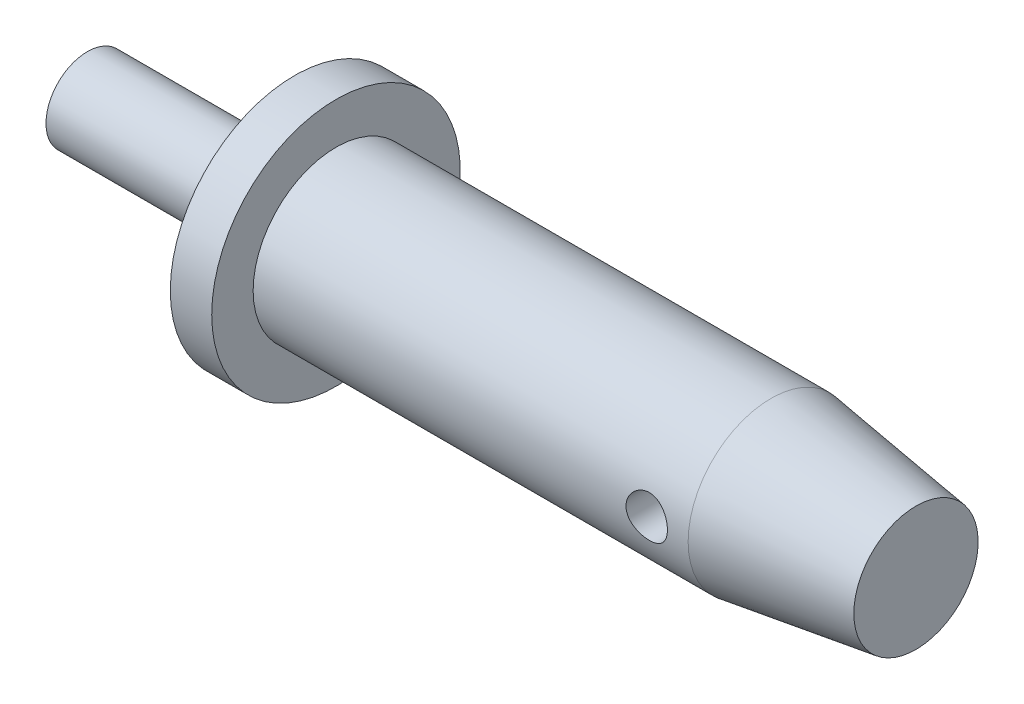
ISO-10303-21;
HEADER;
FILE_DESCRIPTION(('STEP AP214'),'2;1');
FILE_NAME('part.step','',(''),(''),'','','');
FILE_SCHEMA(('AUTOMOTIVE_DESIGN { 1 0 10303 214 1 1 1 1 }'));
ENDSEC;
DATA;
#1=APPLICATION_CONTEXT('core data for automotive mechanical design processes');
#2=APPLICATION_PROTOCOL_DEFINITION('international standard','automotive_design',2000,#1);
#3=PRODUCT_CONTEXT('',#1,'mechanical');
#4=PRODUCT('Part','Part','',(#3));
#5=PRODUCT_RELATED_PRODUCT_CATEGORY('part','',(#4));
#6=PRODUCT_DEFINITION_FORMATION('','',#4);
#7=PRODUCT_DEFINITION_CONTEXT('part definition',#1,'design');
#8=PRODUCT_DEFINITION('design','',#6,#7);
#9=PRODUCT_DEFINITION_SHAPE('','',#8);
#10=(LENGTH_UNIT() NAMED_UNIT(*) SI_UNIT(.MILLI.,.METRE.));
#11=(NAMED_UNIT(*) PLANE_ANGLE_UNIT() SI_UNIT($,.RADIAN.));
#12=(NAMED_UNIT(*) SI_UNIT($,.STERADIAN.) SOLID_ANGLE_UNIT());
#13=UNCERTAINTY_MEASURE_WITH_UNIT(LENGTH_MEASURE(1.E-05),#10,'distance_accuracy_value','');
#14=(GEOMETRIC_REPRESENTATION_CONTEXT(3) GLOBAL_UNCERTAINTY_ASSIGNED_CONTEXT((#13)) GLOBAL_UNIT_ASSIGNED_CONTEXT((#10,
#11,#12)) REPRESENTATION_CONTEXT('',''));
#15=CARTESIAN_POINT('',(0.,0.,0.));
#16=DIRECTION('',(0.,0.,1.));
#17=DIRECTION('',(1.,0.,0.));
#18=AXIS2_PLACEMENT_3D('',#15,#16,#17);
#19=CARTESIAN_POINT('',(0.,0.,0.));
#20=DIRECTION('',(1.,0.,0.));
#21=DIRECTION('',(0.,0.,-1.));
#22=AXIS2_PLACEMENT_3D('',#19,#20,#21);
#23=PLANE('',#22);
#24=CARTESIAN_POINT('',(0.,0.,0.));
#25=DIRECTION('',(-1.,0.,0.));
#26=DIRECTION('',(0.,0.,1.));
#27=AXIS2_PLACEMENT_3D('',#24,#25,#26);
#28=CIRCLE('',#27,10.);
#29=CARTESIAN_POINT('',(0.,0.,10.));
#30=VERTEX_POINT('',#29);
#31=EDGE_CURVE('E43',#30,#30,#28,.T.);
#32=ORIENTED_EDGE('',*,*,#31,.T.);
#33=EDGE_LOOP('',(#32));
#34=FACE_BOUND('',#33,.T.);
#35=ADVANCED_FACE('F32',(#34),#23,.F.);
#36=CARTESIAN_POINT('',(0.,0.,0.));
#37=DIRECTION('',(-1.,0.,0.));
#38=DIRECTION('',(0.,0.,1.));
#39=AXIS2_PLACEMENT_3D('',#36,#37,#38);
#40=CYLINDRICAL_SURFACE('',#39,10.);
#41=ORIENTED_EDGE('',*,*,#31,.F.);
#42=EDGE_LOOP('',(#41));
#43=FACE_BOUND('',#42,.T.);
#44=CARTESIAN_POINT('',(50.,0.,0.));
#45=DIRECTION('',(-1.,0.,0.));
#46=DIRECTION('',(0.,0.,1.));
#47=AXIS2_PLACEMENT_3D('',#44,#45,#46);
#48=CIRCLE('',#47,10.);
#49=CARTESIAN_POINT('',(50.,0.,10.));
#50=VERTEX_POINT('',#49);
#51=EDGE_CURVE('E47',#50,#50,#48,.T.);
#52=ORIENTED_EDGE('',*,*,#51,.T.);
#53=EDGE_LOOP('',(#52));
#54=FACE_BOUND('',#53,.T.);
#55=ADVANCED_FACE('F76',(#43,#54),#40,.T.);
#56=CARTESIAN_POINT('',(50.,10.,0.));
#57=DIRECTION('',(1.,0.,0.));
#58=DIRECTION('',(0.,0.,-1.));
#59=AXIS2_PLACEMENT_3D('',#56,#57,#58);
#60=PLANE('',#59);
#61=ORIENTED_EDGE('',*,*,#51,.F.);
#62=EDGE_LOOP('',(#61));
#63=FACE_BOUND('',#62,.T.);
#64=CARTESIAN_POINT('',(50.,0.,0.));
#65=DIRECTION('',(-1.,0.,0.));
#66=DIRECTION('',(0.,0.,1.));
#67=AXIS2_PLACEMENT_3D('',#64,#65,#66);
#68=CIRCLE('',#67,30.);
#69=CARTESIAN_POINT('',(50.,0.,30.));
#70=VERTEX_POINT('',#69);
#71=EDGE_CURVE('E88',#70,#70,#68,.T.);
#72=ORIENTED_EDGE('',*,*,#71,.T.);
#73=EDGE_LOOP('',(#72));
#74=FACE_BOUND('',#73,.T.);
#75=ADVANCED_FACE('F81',(#63,#74),#60,.F.);
#76=CARTESIAN_POINT('',(0.,0.,0.));
#77=DIRECTION('',(-1.,0.,0.));
#78=DIRECTION('',(0.,0.,1.));
#79=AXIS2_PLACEMENT_3D('',#76,#77,#78);
#80=CYLINDRICAL_SURFACE('',#79,30.);
#81=ORIENTED_EDGE('',*,*,#71,.F.);
#82=EDGE_LOOP('',(#81));
#83=FACE_BOUND('',#82,.T.);
#84=CARTESIAN_POINT('',(60.,0.,0.));
#85=DIRECTION('',(-1.,0.,0.));
#86=DIRECTION('',(0.,0.,1.));
#87=AXIS2_PLACEMENT_3D('',#84,#85,#86);
#88=CIRCLE('',#87,30.);
#89=CARTESIAN_POINT('',(60.,0.,30.));
#90=VERTEX_POINT('',#89);
#91=EDGE_CURVE('E90',#90,#90,#88,.T.);
#92=ORIENTED_EDGE('',*,*,#91,.T.);
#93=EDGE_LOOP('',(#92));
#94=FACE_BOUND('',#93,.T.);
#95=ADVANCED_FACE('F112',(#83,#94),#80,.T.);
#96=CARTESIAN_POINT('',(60.,30.,0.));
#97=DIRECTION('',(-1.,0.,0.));
#98=DIRECTION('',(0.,0.,1.));
#99=AXIS2_PLACEMENT_3D('',#96,#97,#98);
#100=PLANE('',#99);
#101=ORIENTED_EDGE('',*,*,#91,.F.);
#102=EDGE_LOOP('',(#101));
#103=FACE_BOUND('',#102,.T.);
#104=CARTESIAN_POINT('',(60.,0.,0.));
#105=DIRECTION('',(-1.,0.,0.));
#106=DIRECTION('',(0.,0.,1.));
#107=AXIS2_PLACEMENT_3D('',#104,#105,#106);
#108=CIRCLE('',#107,20.);
#109=CARTESIAN_POINT('',(60.,0.,20.));
#110=VERTEX_POINT('',#109);
#111=EDGE_CURVE('E95',#110,#110,#108,.T.);
#112=ORIENTED_EDGE('',*,*,#111,.T.);
#113=EDGE_LOOP('',(#112));
#114=FACE_BOUND('',#113,.T.);
#115=ADVANCED_FACE('F71',(#103,#114),#100,.F.);
#116=CARTESIAN_POINT('',(0.,0.,0.));
#117=DIRECTION('',(-1.,0.,0.));
#118=DIRECTION('',(0.,0.,1.));
#119=AXIS2_PLACEMENT_3D('',#116,#117,#118);
#120=CYLINDRICAL_SURFACE('',#119,20.);
#121=CARTESIAN_POINT('',(160.,0.,-20.));
#122=CARTESIAN_POINT('',(159.999992247539,0.276253628899103,-19.9999953289337));
#123=CARTESIAN_POINT('',(159.977028164087,0.552593859435875,-19.9942192710609));
#124=CARTESIAN_POINT('',(159.88591616231,1.09735441256844,-19.9717371276631));
#125=CARTESIAN_POINT('',(159.817742634874,1.3657701562358,-19.9550248473325));
#126=CARTESIAN_POINT('',(159.638535821793,1.88673624060859,-19.9125208777344));
#127=CARTESIAN_POINT('',(159.527554004282,2.13930521143334,-19.8867400947353));
#128=CARTESIAN_POINT('',(159.266062033184,2.62224043968142,-19.8288447935874));
#129=CARTESIAN_POINT('',(159.11555054627,2.8526059478292,-19.7967300618052));
#130=CARTESIAN_POINT('',(158.775997367819,3.28933975766971,-19.7289137863898));
#131=CARTESIAN_POINT('',(158.586294750136,3.49518563353686,-19.6931569049375));
#132=CARTESIAN_POINT('',(158.17515931697,3.87249642401107,-19.6224540039312));
#133=CARTESIAN_POINT('',(157.95372292351,4.0439574564973,-19.5875080763289));
#134=CARTESIAN_POINT('',(157.48134924421,4.35008847599658,-19.5218258566056));
#135=CARTESIAN_POINT('',(157.230022563971,4.4841740530838,-19.4911598154937));
#136=CARTESIAN_POINT('',(156.707505294467,4.70798969516914,-19.4383164939339));
#137=CARTESIAN_POINT('',(156.436317888893,4.79772685146713,-19.4161378564806));
#138=CARTESIAN_POINT('',(155.887521672661,4.92851612268254,-19.3833492232108));
#139=CARTESIAN_POINT('',(155.61015034654,4.97050756110683,-19.372516366567));
#140=CARTESIAN_POINT('',(155.052104770002,5.00753925022135,-19.362978748653));
#141=CARTESIAN_POINT('',(154.77143106436,5.00258713939369,-19.3642720142643));
#142=CARTESIAN_POINT('',(154.221947307516,4.94662174879901,-19.3786401838939));
#143=CARTESIAN_POINT('',(153.953014595116,4.89672780063544,-19.3914287669098));
#144=CARTESIAN_POINT('',(153.42746316363,4.75408062300997,-19.426890322369));
#145=CARTESIAN_POINT('',(153.170845323237,4.66132434023129,-19.4495639989746));
#146=CARTESIAN_POINT('',(152.674206612493,4.43463159312393,-19.5025037968553));
#147=CARTESIAN_POINT('',(152.434379427368,4.30028889077638,-19.5328442489939));
#148=CARTESIAN_POINT('',(151.980270967477,3.99452092004981,-19.5976570281997));
#149=CARTESIAN_POINT('',(151.765994173109,3.82308916269612,-19.6321300778209));
#150=CARTESIAN_POINT('',(151.362654614352,3.44221141560407,-19.7025293513297));
#151=CARTESIAN_POINT('',(151.174485033129,3.23182086055287,-19.7384689826));
#152=CARTESIAN_POINT('',(150.835929191787,2.78203972501233,-19.8068655192919));
#153=CARTESIAN_POINT('',(150.685544085788,2.54264825902647,-19.8393223183136));
#154=CARTESIAN_POINT('',(150.426498045919,2.04038629560463,-19.897257736473));
#155=CARTESIAN_POINT('',(150.317982199152,1.77743797736207,-19.9227120042576));
#156=CARTESIAN_POINT('',(150.146942314301,1.23625336047627,-19.9635972330472));
#157=CARTESIAN_POINT('',(150.084409478606,0.958019997168278,-19.9790301113094));
#158=CARTESIAN_POINT('',(150.008474781471,0.401799901300085,-19.9978499757125));
#159=CARTESIAN_POINT('',(149.993856579749,0.123989066627363,-20.0015351169426));
#160=CARTESIAN_POINT('',(150.010830006852,-0.430109582671698,-19.9972934938151));
#161=CARTESIAN_POINT('',(150.042417475997,-0.706397532148656,-19.9893677747284));
#162=CARTESIAN_POINT('',(150.149903027971,-1.24538089592164,-19.9629860375783));
#163=CARTESIAN_POINT('',(150.225137544923,-1.50821706322917,-19.9446878061929));
#164=CARTESIAN_POINT('',(150.417023613428,-2.01752430817505,-19.8996235544719));
#165=CARTESIAN_POINT('',(150.533679347711,-2.26399373010884,-19.8728566789995));
#166=CARTESIAN_POINT('',(150.807453762916,-2.73841044809943,-19.8131102642072));
#167=CARTESIAN_POINT('',(150.965253707989,-2.96595147278588,-19.7800289122193));
#168=CARTESIAN_POINT('',(151.315966362657,-3.39175537881103,-19.7114836395924));
#169=CARTESIAN_POINT('',(151.508885132059,-3.5900131965775,-19.676019308434));
#170=CARTESIAN_POINT('',(151.930006536146,-3.95663522690825,-19.6056318986475));
#171=CARTESIAN_POINT('',(152.158959009999,-4.12414622540361,-19.57074347274));
#172=CARTESIAN_POINT('',(152.642442114895,-4.41836919671214,-19.5064292794107));
#173=CARTESIAN_POINT('',(152.896971609901,-4.54508298053822,-19.4770032695336));
#174=CARTESIAN_POINT('',(153.423019074688,-4.75317140202424,-19.4272698238587));
#175=CARTESIAN_POINT('',(153.69442542771,-4.83481465547782,-19.4069085073875));
#176=CARTESIAN_POINT('',(154.247698792848,-4.95115219981055,-19.3775581342603));
#177=CARTESIAN_POINT('',(154.529563503395,-4.98585675825594,-19.3685665905607));
#178=CARTESIAN_POINT('',(155.08707007956,-5.00679530111927,-19.3631633735661));
#179=CARTESIAN_POINT('',(155.362658117146,-4.99439299259114,-19.366397756045));
#180=CARTESIAN_POINT('',(155.907679628939,-4.92459092769652,-19.3842636317313));
#181=CARTESIAN_POINT('',(156.17711322672,-4.86719207562104,-19.3988948958968));
#182=CARTESIAN_POINT('',(156.700694863533,-4.709771064814,-19.4377086899188));
#183=CARTESIAN_POINT('',(156.954924350796,-4.61000468226917,-19.461833841343));
#184=CARTESIAN_POINT('',(157.443217942384,-4.37088304534897,-19.5169251906949));
#185=CARTESIAN_POINT('',(157.677279243958,-4.23152230011361,-19.5478923373231));
#186=CARTESIAN_POINT('',(158.125182096672,-3.91289249545747,-19.6141878088207));
#187=CARTESIAN_POINT('',(158.338336911413,-3.73267720970761,-19.6496088277351));
#188=CARTESIAN_POINT('',(158.731823482652,-3.33929790396569,-19.7202675748663));
#189=CARTESIAN_POINT('',(158.91214743371,-3.12612607087046,-19.755505257566));
#190=CARTESIAN_POINT('',(159.238037695215,-2.66822528900866,-19.8225885215915));
#191=CARTESIAN_POINT('',(159.382915378905,-2.42299474105463,-19.8543611121963));
#192=CARTESIAN_POINT('',(159.629158209802,-1.91088686503491,-19.9101641658366));
#193=CARTESIAN_POINT('',(159.730554535495,-1.64402521145579,-19.9342001733259));
#194=CARTESIAN_POINT('',(159.871906101099,-1.14803417747823,-19.9682686521849));
#195=CARTESIAN_POINT('',(159.919837476845,-0.921267236360223,-19.980086168423));
#196=CARTESIAN_POINT('',(159.98388647874,-0.463020238454275,-19.9959535077316));
#197=CARTESIAN_POINT('',(160.000006497684,-0.231540537475386,-20.0000039150298));
#198=CARTESIAN_POINT('',(160.,0.,-20.));
#199=B_SPLINE_CURVE_WITH_KNOTS('',3,(#121,#122,#123,#124,#125,#126,#127,#128,#129,#130,#131,
#132,#133,#134,#135,#136,#137,#138,#139,#140,#141,#142,#143,#144,#145,#146,#147,#148,#149,#150,
#151,#152,#153,#154,#155,#156,#157,#158,#159,#160,#161,#162,#163,#164,#165,#166,#167,#168,#169,
#170,#171,#172,#173,#174,#175,#176,#177,#178,#179,#180,#181,#182,#183,#184,#185,#186,#187,#188,
#189,#190,#191,#192,#193,#194,#195,#196,#197,#198),.UNSPECIFIED.,.T.,.F.,(4,2,2,2,2,2,2,2,2,2,2,
2,2,2,2,2,2,2,2,2,2,2,2,2,2,2,2,2,2,2,2,2,2,2,2,2,2,2,4),(0.,0.827912374906298,1.65629412587966,
2.48368300762035,3.31109980056443,4.1538145145713,4.99662431933541,5.85195491819357,
6.70714870564559,7.54520983670231,8.38313460386721,9.2007499003446,10.0184234489786,
10.84435092924,11.6704230279827,12.5200500324113,13.3697029853856,14.2222743004145,
15.0746824563988,15.9052769650865,16.7357967038688,17.5540091505786,18.372304244187,
19.2051195856224,20.0380787670446,20.8914836402598,21.7448506250942,22.5930751539526,
23.4411141086095,24.2647926801851,25.0884546987995,25.9072133522466,26.7260856048284,
27.5663192139287,28.4067523259456,29.2624061835846,30.1174454609767,30.8114080983366,
31.505318535033),.UNSPECIFIED.);
#200=CARTESIAN_POINT('',(160.,0.,-20.));
#201=VERTEX_POINT('',#200);
#202=EDGE_CURVE('E35',#201,#201,#199,.T.);
#203=ORIENTED_EDGE('',*,*,#202,.T.);
#204=EDGE_LOOP('',(#203));
#205=FACE_BOUND('',#204,.T.);
#206=CARTESIAN_POINT('',(160.,0.,20.));
#207=CARTESIAN_POINT('',(159.999992247539,-0.276253628899103,19.9999953289337));
#208=CARTESIAN_POINT('',(159.977028164087,-0.552593859435875,19.9942192710609));
#209=CARTESIAN_POINT('',(159.88591616231,-1.09735441256844,19.9717371276631));
#210=CARTESIAN_POINT('',(159.817742634874,-1.3657701562358,19.9550248473325));
#211=CARTESIAN_POINT('',(159.638535821793,-1.88673624060859,19.9125208777344));
#212=CARTESIAN_POINT('',(159.527554004282,-2.13930521143334,19.8867400947353));
#213=CARTESIAN_POINT('',(159.266062033184,-2.62224043968142,19.8288447935874));
#214=CARTESIAN_POINT('',(159.11555054627,-2.8526059478292,19.7967300618052));
#215=CARTESIAN_POINT('',(158.775997367819,-3.28933975766971,19.7289137863898));
#216=CARTESIAN_POINT('',(158.586294750136,-3.49518563353686,19.6931569049375));
#217=CARTESIAN_POINT('',(158.17515931697,-3.87249642401107,19.6224540039312));
#218=CARTESIAN_POINT('',(157.95372292351,-4.0439574564973,19.5875080763289));
#219=CARTESIAN_POINT('',(157.48134924421,-4.35008847599658,19.5218258566056));
#220=CARTESIAN_POINT('',(157.230022563971,-4.4841740530838,19.4911598154937));
#221=CARTESIAN_POINT('',(156.707505294467,-4.70798969516914,19.4383164939339));
#222=CARTESIAN_POINT('',(156.436317888893,-4.79772685146713,19.4161378564806));
#223=CARTESIAN_POINT('',(155.887521672661,-4.92851612268254,19.3833492232108));
#224=CARTESIAN_POINT('',(155.61015034654,-4.97050756110683,19.372516366567));
#225=CARTESIAN_POINT('',(155.052104770002,-5.00753925022135,19.362978748653));
#226=CARTESIAN_POINT('',(154.77143106436,-5.00258713939369,19.3642720142643));
#227=CARTESIAN_POINT('',(154.221947307516,-4.94662174879901,19.3786401838939));
#228=CARTESIAN_POINT('',(153.953014595116,-4.89672780063544,19.3914287669098));
#229=CARTESIAN_POINT('',(153.42746316363,-4.75408062300997,19.426890322369));
#230=CARTESIAN_POINT('',(153.170845323237,-4.66132434023129,19.4495639989746));
#231=CARTESIAN_POINT('',(152.674206612493,-4.43463159312393,19.5025037968553));
#232=CARTESIAN_POINT('',(152.434379427368,-4.30028889077638,19.5328442489939));
#233=CARTESIAN_POINT('',(151.980270967477,-3.99452092004981,19.5976570281997));
#234=CARTESIAN_POINT('',(151.765994173109,-3.82308916269612,19.6321300778209));
#235=CARTESIAN_POINT('',(151.362654614352,-3.44221141560407,19.7025293513297));
#236=CARTESIAN_POINT('',(151.174485033129,-3.23182086055287,19.7384689826));
#237=CARTESIAN_POINT('',(150.835929191787,-2.78203972501233,19.8068655192919));
#238=CARTESIAN_POINT('',(150.685544085788,-2.54264825902647,19.8393223183136));
#239=CARTESIAN_POINT('',(150.426498045919,-2.04038629560463,19.897257736473));
#240=CARTESIAN_POINT('',(150.317982199152,-1.77743797736207,19.9227120042576));
#241=CARTESIAN_POINT('',(150.146942314301,-1.23625336047627,19.9635972330472));
#242=CARTESIAN_POINT('',(150.084409478606,-0.958019997168278,19.9790301113094));
#243=CARTESIAN_POINT('',(150.008474781471,-0.401799901300085,19.9978499757125));
#244=CARTESIAN_POINT('',(149.993856579749,-0.123989066627363,20.0015351169426));
#245=CARTESIAN_POINT('',(150.010830006852,0.430109582671698,19.9972934938151));
#246=CARTESIAN_POINT('',(150.042417475997,0.706397532148656,19.9893677747284));
#247=CARTESIAN_POINT('',(150.149903027971,1.24538089592164,19.9629860375783));
#248=CARTESIAN_POINT('',(150.225137544923,1.50821706322917,19.9446878061929));
#249=CARTESIAN_POINT('',(150.417023613428,2.01752430817505,19.8996235544719));
#250=CARTESIAN_POINT('',(150.533679347711,2.26399373010884,19.8728566789995));
#251=CARTESIAN_POINT('',(150.807453762916,2.73841044809943,19.8131102642072));
#252=CARTESIAN_POINT('',(150.965253707989,2.96595147278588,19.7800289122193));
#253=CARTESIAN_POINT('',(151.315966362657,3.39175537881103,19.7114836395924));
#254=CARTESIAN_POINT('',(151.508885132059,3.5900131965775,19.676019308434));
#255=CARTESIAN_POINT('',(151.930006536146,3.95663522690825,19.6056318986475));
#256=CARTESIAN_POINT('',(152.158959009999,4.12414622540361,19.57074347274));
#257=CARTESIAN_POINT('',(152.642442114895,4.41836919671214,19.5064292794107));
#258=CARTESIAN_POINT('',(152.896971609901,4.54508298053822,19.4770032695336));
#259=CARTESIAN_POINT('',(153.423019074688,4.75317140202424,19.4272698238587));
#260=CARTESIAN_POINT('',(153.69442542771,4.83481465547782,19.4069085073875));
#261=CARTESIAN_POINT('',(154.247698792848,4.95115219981055,19.3775581342603));
#262=CARTESIAN_POINT('',(154.529563503395,4.98585675825594,19.3685665905607));
#263=CARTESIAN_POINT('',(155.08707007956,5.00679530111927,19.3631633735661));
#264=CARTESIAN_POINT('',(155.362658117146,4.99439299259114,19.366397756045));
#265=CARTESIAN_POINT('',(155.907679628939,4.92459092769652,19.3842636317313));
#266=CARTESIAN_POINT('',(156.17711322672,4.86719207562104,19.3988948958968));
#267=CARTESIAN_POINT('',(156.700694863533,4.709771064814,19.4377086899188));
#268=CARTESIAN_POINT('',(156.954924350796,4.61000468226917,19.461833841343));
#269=CARTESIAN_POINT('',(157.443217942384,4.37088304534897,19.5169251906949));
#270=CARTESIAN_POINT('',(157.677279243958,4.23152230011361,19.5478923373231));
#271=CARTESIAN_POINT('',(158.125182096672,3.91289249545747,19.6141878088207));
#272=CARTESIAN_POINT('',(158.338336911413,3.7326772097076,19.6496088277351));
#273=CARTESIAN_POINT('',(158.731823482652,3.33929790396569,19.7202675748663));
#274=CARTESIAN_POINT('',(158.91214743371,3.12612607087046,19.755505257566));
#275=CARTESIAN_POINT('',(159.238037695215,2.66822528900866,19.8225885215915));
#276=CARTESIAN_POINT('',(159.382915378905,2.42299474105463,19.8543611121963));
#277=CARTESIAN_POINT('',(159.629158209802,1.91088686503491,19.9101641658366));
#278=CARTESIAN_POINT('',(159.730554535495,1.64402521145579,19.9342001733259));
#279=CARTESIAN_POINT('',(159.871906101099,1.14803417747823,19.9682686521849));
#280=CARTESIAN_POINT('',(159.919837476845,0.921267236360223,19.980086168423));
#281=CARTESIAN_POINT('',(159.98388647874,0.463020238454275,19.9959535077316));
#282=CARTESIAN_POINT('',(160.000006497684,0.231540537475386,20.0000039150298));
#283=CARTESIAN_POINT('',(160.,0.,20.));
#284=B_SPLINE_CURVE_WITH_KNOTS('',3,(#206,#207,#208,#209,#210,#211,#212,#213,#214,#215,#216,
#217,#218,#219,#220,#221,#222,#223,#224,#225,#226,#227,#228,#229,#230,#231,#232,#233,#234,#235,
#236,#237,#238,#239,#240,#241,#242,#243,#244,#245,#246,#247,#248,#249,#250,#251,#252,#253,#254,
#255,#256,#257,#258,#259,#260,#261,#262,#263,#264,#265,#266,#267,#268,#269,#270,#271,#272,#273,
#274,#275,#276,#277,#278,#279,#280,#281,#282,#283),.UNSPECIFIED.,.T.,.F.,(4,2,2,2,2,2,2,2,2,2,2,
2,2,2,2,2,2,2,2,2,2,2,2,2,2,2,2,2,2,2,2,2,2,2,2,2,2,2,4),(0.,0.827912374906298,1.65629412587966,
2.48368300762035,3.31109980056443,4.1538145145713,4.99662431933541,5.85195491819357,
6.70714870564559,7.54520983670231,8.38313460386721,9.2007499003446,10.0184234489786,
10.84435092924,11.6704230279827,12.5200500324113,13.3697029853856,14.2222743004145,
15.0746824563988,15.9052769650865,16.7357967038688,17.5540091505786,18.372304244187,
19.2051195856224,20.0380787670446,20.8914836402598,21.7448506250942,22.5930751539526,
23.4411141086095,24.2647926801851,25.0884546987995,25.9072133522466,26.7260856048284,
27.5663192139287,28.4067523259456,29.2624061835846,30.1174454609767,30.8114080983366,
31.505318535033),.UNSPECIFIED.);
#285=CARTESIAN_POINT('',(160.,0.,20.));
#286=VERTEX_POINT('',#285);
#287=EDGE_CURVE('E10',#286,#286,#284,.T.);
#288=ORIENTED_EDGE('',*,*,#287,.T.);
#289=EDGE_LOOP('',(#288));
#290=FACE_BOUND('',#289,.T.);
#291=ORIENTED_EDGE('',*,*,#111,.F.);
#292=EDGE_LOOP('',(#291));
#293=FACE_BOUND('',#292,.T.);
#294=CARTESIAN_POINT('',(165.,0.,0.));
#295=DIRECTION('',(-1.,0.,0.));
#296=DIRECTION('',(0.,0.,1.));
#297=AXIS2_PLACEMENT_3D('',#294,#295,#296);
#298=CIRCLE('',#297,20.);
#299=CARTESIAN_POINT('',(165.,0.,20.));
#300=VERTEX_POINT('',#299);
#301=EDGE_CURVE('E98',#300,#300,#298,.T.);
#302=ORIENTED_EDGE('',*,*,#301,.T.);
#303=EDGE_LOOP('',(#302));
#304=FACE_BOUND('',#303,.T.);
#305=ADVANCED_FACE('F52',(#205,#290,#293,#304),#120,.T.);
#306=CARTESIAN_POINT('',(200.,0.,0.));
#307=DIRECTION('',(-1.,0.,0.));
#308=DIRECTION('',(0.,0.,1.));
#309=AXIS2_PLACEMENT_3D('',#306,#307,#308);
#310=CONICAL_SURFACE('',#309,15.,0.141897054604164);
#311=ORIENTED_EDGE('',*,*,#301,.F.);
#312=EDGE_LOOP('',(#311));
#313=FACE_BOUND('',#312,.T.);
#314=CARTESIAN_POINT('',(200.,0.,0.));
#315=DIRECTION('',(-1.,0.,0.));
#316=DIRECTION('',(0.,0.,1.));
#317=AXIS2_PLACEMENT_3D('',#314,#315,#316);
#318=CIRCLE('',#317,15.);
#319=CARTESIAN_POINT('',(200.,0.,15.));
#320=VERTEX_POINT('',#319);
#321=EDGE_CURVE('E101',#320,#320,#318,.T.);
#322=ORIENTED_EDGE('',*,*,#321,.T.);
#323=EDGE_LOOP('',(#322));
#324=FACE_BOUND('',#323,.T.);
#325=ADVANCED_FACE('F64',(#313,#324),#310,.T.);
#326=CARTESIAN_POINT('',(200.,15.,0.));
#327=DIRECTION('',(-1.,0.,0.));
#328=DIRECTION('',(0.,0.,1.));
#329=AXIS2_PLACEMENT_3D('',#326,#327,#328);
#330=PLANE('',#329);
#331=ORIENTED_EDGE('',*,*,#321,.F.);
#332=EDGE_LOOP('',(#331));
#333=FACE_BOUND('',#332,.T.);
#334=ADVANCED_FACE('F60',(#333),#330,.F.);
#335=CARTESIAN_POINT('',(155.,0.,-30.));
#336=DIRECTION('',(0.,0.,1.));
#337=DIRECTION('',(1.,0.,0.));
#338=AXIS2_PLACEMENT_3D('',#335,#336,#337);
#339=CYLINDRICAL_SURFACE('',#338,4.99999999999999);
#340=ORIENTED_EDGE('',*,*,#202,.F.);
#341=EDGE_LOOP('',(#340));
#342=FACE_BOUND('',#341,.T.);
#343=ORIENTED_EDGE('',*,*,#287,.F.);
#344=EDGE_LOOP('',(#343));
#345=FACE_BOUND('',#344,.T.);
#346=ADVANCED_FACE('F56',(#342,#345),#339,.F.);
#347=CLOSED_SHELL('',(#35,#55,#75,#95,#115,#305,#325,#334,#346));
#348=MANIFOLD_SOLID_BREP('B2',#347);
#349=ADVANCED_BREP_SHAPE_REPRESENTATION('',(#18,#348),#14);
#350=SHAPE_DEFINITION_REPRESENTATION(#9,#349);
ENDSEC;
END-ISO-10303-21;
